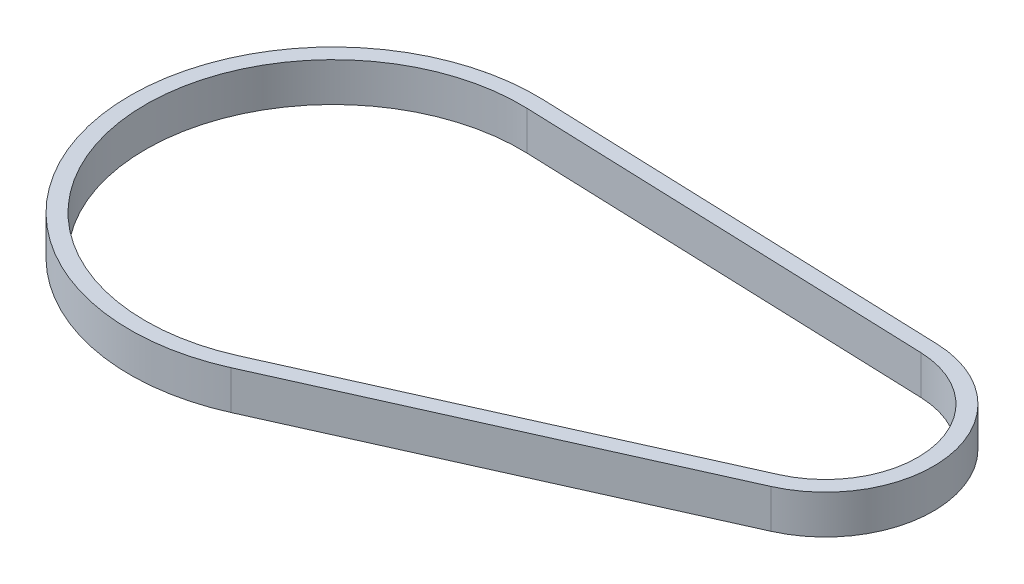
ISO-10303-21;
HEADER;
FILE_DESCRIPTION(('STEP AP214'),'2;1');
FILE_NAME('part.step','',(''),(''),'','','');
FILE_SCHEMA(('AUTOMOTIVE_DESIGN { 1 0 10303 214 1 1 1 1 }'));
ENDSEC;
DATA;
#1=APPLICATION_CONTEXT('core data for automotive mechanical design processes');
#2=APPLICATION_PROTOCOL_DEFINITION('international standard','automotive_design',2000,#1);
#3=PRODUCT_CONTEXT('',#1,'mechanical');
#4=PRODUCT('Part','Part','',(#3));
#5=PRODUCT_RELATED_PRODUCT_CATEGORY('part','',(#4));
#6=PRODUCT_DEFINITION_FORMATION('','',#4);
#7=PRODUCT_DEFINITION_CONTEXT('part definition',#1,'design');
#8=PRODUCT_DEFINITION('design','',#6,#7);
#9=PRODUCT_DEFINITION_SHAPE('','',#8);
#10=(LENGTH_UNIT() NAMED_UNIT(*) SI_UNIT(.MILLI.,.METRE.));
#11=(NAMED_UNIT(*) PLANE_ANGLE_UNIT() SI_UNIT($,.RADIAN.));
#12=(NAMED_UNIT(*) SI_UNIT($,.STERADIAN.) SOLID_ANGLE_UNIT());
#13=UNCERTAINTY_MEASURE_WITH_UNIT(LENGTH_MEASURE(1.E-05),#10,'distance_accuracy_value','');
#14=(GEOMETRIC_REPRESENTATION_CONTEXT(3) GLOBAL_UNCERTAINTY_ASSIGNED_CONTEXT((#13)) GLOBAL_UNIT_ASSIGNED_CONTEXT((#10,
#11,#12)) REPRESENTATION_CONTEXT('',''));
#15=CARTESIAN_POINT('',(0.,0.,0.));
#16=DIRECTION('',(0.,0.,1.));
#17=DIRECTION('',(1.,0.,0.));
#18=AXIS2_PLACEMENT_3D('',#15,#16,#17);
#19=CARTESIAN_POINT('',(0.,10.,0.));
#20=DIRECTION('',(0.,1.,0.));
#21=DIRECTION('',(0.,0.,1.));
#22=AXIS2_PLACEMENT_3D('',#19,#20,#21);
#23=PLANE('',#22);
#24=CARTESIAN_POINT('',(0.,10.,0.));
#25=DIRECTION('',(0.,1.,0.));
#26=DIRECTION('',(0.,0.,1.));
#27=AXIS2_PLACEMENT_3D('',#24,#25,#26);
#28=CIRCLE('',#27,52.26);
#29=CARTESIAN_POINT('',(1.87511613569764,10.,-52.2263490919827));
#30=VERTEX_POINT('',#29);
#31=CARTESIAN_POINT('',(21.3772791952172,10.,47.687729388279));
#32=VERTEX_POINT('',#31);
#33=EDGE_CURVE('E159',#30,#32,#28,.T.);
#34=ORIENTED_EDGE('',*,*,#33,.T.);
#35=DIRECTION('',(0.912509173139668,0.,-0.409056241776067));
#36=VECTOR('',#35,1.);
#37=CARTESIAN_POINT('',(117.363223433667,10.,4.65950482981999));
#38=LINE('',#37,#36);
#39=CARTESIAN_POINT('',(117.363223433667,10.,4.65950482981999));
#40=VERTEX_POINT('',#39);
#41=EDGE_CURVE('E163',#32,#40,#38,.T.);
#42=ORIENTED_EDGE('',*,*,#41,.T.);
#43=CARTESIAN_POINT('',(105.999641037128,10.,-20.69));
#44=DIRECTION('',(0.,1.,0.));
#45=DIRECTION('',(0.,0.,1.));
#46=AXIS2_PLACEMENT_3D('',#43,#44,#45);
#47=CIRCLE('',#46,27.78);
#48=CARTESIAN_POINT('',(106.996401968044,10.,-48.4521120890792));
#49=VERTEX_POINT('',#48);
#50=EDGE_CURVE('E167',#40,#49,#47,.T.);
#51=ORIENTED_EDGE('',*,*,#50,.T.);
#52=DIRECTION('',(-0.999356086719915,0.,-0.0358805230711372));
#53=VECTOR('',#52,1.);
#54=CARTESIAN_POINT('',(1.87511613569764,10.,-52.2263490919827));
#55=LINE('',#54,#53);
#56=EDGE_CURVE('E170',#49,#30,#55,.T.);
#57=ORIENTED_EDGE('',*,*,#56,.T.);
#58=EDGE_LOOP('',(#34,#42,#51,#57));
#59=FACE_BOUND('',#58,.T.);
#60=DIRECTION('',(-0.999356086719915,0.,-0.0358805230711372));
#61=VECTOR('',#60,1.);
#62=CARTESIAN_POINT('',(1.73159404341309,10.,-48.2289247451031));
#63=LINE('',#62,#61);
#64=CARTESIAN_POINT('',(106.85287987576,10.,-44.4546877421996));
#65=VERTEX_POINT('',#64);
#66=CARTESIAN_POINT('',(1.73159404341309,10.,-48.2289247451031));
#67=VERTEX_POINT('',#66);
#68=EDGE_CURVE('E120',#65,#67,#63,.T.);
#69=ORIENTED_EDGE('',*,*,#68,.F.);
#70=CARTESIAN_POINT('',(105.999641037128,10.,-20.69));
#71=DIRECTION('',(0.,1.,0.));
#72=DIRECTION('',(0.,0.,1.));
#73=AXIS2_PLACEMENT_3D('',#70,#71,#72);
#74=CIRCLE('',#73,23.78);
#75=CARTESIAN_POINT('',(115.726998466563,10.,1.00946813726131));
#76=VERTEX_POINT('',#75);
#77=EDGE_CURVE('E111',#76,#65,#74,.T.);
#78=ORIENTED_EDGE('',*,*,#77,.F.);
#79=DIRECTION('',(0.912509173139668,0.,-0.409056241776067));
#80=VECTOR('',#79,1.);
#81=CARTESIAN_POINT('',(115.726998466563,10.,1.00946813726131));
#82=LINE('',#81,#80);
#83=CARTESIAN_POINT('',(19.741054228113,10.,44.0376926957204));
#84=VERTEX_POINT('',#83);
#85=EDGE_CURVE('E137',#84,#76,#82,.T.);
#86=ORIENTED_EDGE('',*,*,#85,.F.);
#87=CARTESIAN_POINT('',(0.,10.,0.));
#88=DIRECTION('',(0.,1.,0.));
#89=DIRECTION('',(0.,0.,1.));
#90=AXIS2_PLACEMENT_3D('',#87,#88,#89);
#91=CIRCLE('',#90,48.26);
#92=EDGE_CURVE('E133',#67,#84,#91,.T.);
#93=ORIENTED_EDGE('',*,*,#92,.F.);
#94=EDGE_LOOP('',(#69,#78,#86,#93));
#95=FACE_BOUND('',#94,.T.);
#96=ADVANCED_FACE('F45',(#59,#95),#23,.T.);
#97=CARTESIAN_POINT('',(0.,0.,0.));
#98=DIRECTION('',(0.,1.,0.));
#99=DIRECTION('',(0.,0.,1.));
#100=AXIS2_PLACEMENT_3D('',#97,#98,#99);
#101=PLANE('',#100);
#102=CARTESIAN_POINT('',(0.,0.,0.));
#103=DIRECTION('',(0.,1.,0.));
#104=DIRECTION('',(0.,0.,1.));
#105=AXIS2_PLACEMENT_3D('',#102,#103,#104);
#106=CIRCLE('',#105,52.26);
#107=CARTESIAN_POINT('',(1.87511613569764,0.,-52.2263490919827));
#108=VERTEX_POINT('',#107);
#109=CARTESIAN_POINT('',(21.3772791952172,0.,47.687729388279));
#110=VERTEX_POINT('',#109);
#111=EDGE_CURVE('E129',#108,#110,#106,.T.);
#112=ORIENTED_EDGE('',*,*,#111,.F.);
#113=DIRECTION('',(-0.999356086719915,0.,-0.0358805230711372));
#114=VECTOR('',#113,1.);
#115=CARTESIAN_POINT('',(1.87511613569764,0.,-52.2263490919827));
#116=LINE('',#115,#114);
#117=CARTESIAN_POINT('',(106.996401968044,0.,-48.4521120890792));
#118=VERTEX_POINT('',#117);
#119=EDGE_CURVE('E164',#118,#108,#116,.T.);
#120=ORIENTED_EDGE('',*,*,#119,.F.);
#121=CARTESIAN_POINT('',(105.999641037128,0.,-20.69));
#122=DIRECTION('',(0.,1.,0.));
#123=DIRECTION('',(0.,0.,1.));
#124=AXIS2_PLACEMENT_3D('',#121,#122,#123);
#125=CIRCLE('',#124,27.78);
#126=CARTESIAN_POINT('',(117.363223433667,0.,4.65950482981999));
#127=VERTEX_POINT('',#126);
#128=EDGE_CURVE('E180',#127,#118,#125,.T.);
#129=ORIENTED_EDGE('',*,*,#128,.F.);
#130=DIRECTION('',(0.912509173139668,0.,-0.409056241776067));
#131=VECTOR('',#130,1.);
#132=CARTESIAN_POINT('',(117.363223433667,0.,4.65950482981999));
#133=LINE('',#132,#131);
#134=EDGE_CURVE('E177',#110,#127,#133,.T.);
#135=ORIENTED_EDGE('',*,*,#134,.F.);
#136=EDGE_LOOP('',(#112,#120,#129,#135));
#137=FACE_BOUND('',#136,.T.);
#138=CARTESIAN_POINT('',(105.999641037128,0.,-20.69));
#139=DIRECTION('',(0.,1.,0.));
#140=DIRECTION('',(0.,0.,1.));
#141=AXIS2_PLACEMENT_3D('',#138,#139,#140);
#142=CIRCLE('',#141,23.78);
#143=CARTESIAN_POINT('',(115.726998466563,0.,1.0094681372613));
#144=VERTEX_POINT('',#143);
#145=CARTESIAN_POINT('',(106.85287987576,0.,-44.4546877421996));
#146=VERTEX_POINT('',#145);
#147=EDGE_CURVE('E69',#144,#146,#142,.T.);
#148=ORIENTED_EDGE('',*,*,#147,.T.);
#149=DIRECTION('',(-0.999356086719915,0.,-0.0358805230711372));
#150=VECTOR('',#149,1.);
#151=CARTESIAN_POINT('',(1.73159404341309,0.,-48.2289247451031));
#152=LINE('',#151,#150);
#153=CARTESIAN_POINT('',(1.73159404341309,0.,-48.2289247451031));
#154=VERTEX_POINT('',#153);
#155=EDGE_CURVE('E127',#146,#154,#152,.T.);
#156=ORIENTED_EDGE('',*,*,#155,.T.);
#157=CARTESIAN_POINT('',(0.,0.,0.));
#158=DIRECTION('',(0.,1.,0.));
#159=DIRECTION('',(0.,0.,1.));
#160=AXIS2_PLACEMENT_3D('',#157,#158,#159);
#161=CIRCLE('',#160,48.26);
#162=CARTESIAN_POINT('',(19.741054228113,0.,44.0376926957204));
#163=VERTEX_POINT('',#162);
#164=EDGE_CURVE('E146',#154,#163,#161,.T.);
#165=ORIENTED_EDGE('',*,*,#164,.T.);
#166=DIRECTION('',(0.912509173139668,0.,-0.409056241776067));
#167=VECTOR('',#166,1.);
#168=CARTESIAN_POINT('',(115.726998466563,0.,1.00946813726131));
#169=LINE('',#168,#167);
#170=EDGE_CURVE('E121',#163,#144,#169,.T.);
#171=ORIENTED_EDGE('',*,*,#170,.T.);
#172=EDGE_LOOP('',(#148,#156,#165,#171));
#173=FACE_BOUND('',#172,.T.);
#174=ADVANCED_FACE('F203',(#137,#173),#101,.F.);
#175=CARTESIAN_POINT('',(0.,10.,0.));
#176=DIRECTION('',(0.,-1.,0.));
#177=DIRECTION('',(0.,0.,-1.));
#178=AXIS2_PLACEMENT_3D('',#175,#176,#177);
#179=CYLINDRICAL_SURFACE('',#178,52.26);
#180=ORIENTED_EDGE('',*,*,#111,.T.);
#181=DIRECTION('',(0.,-1.,0.));
#182=VECTOR('',#181,1.);
#183=CARTESIAN_POINT('',(21.3772791952172,10.,47.687729388279));
#184=LINE('',#183,#182);
#185=EDGE_CURVE('E11',#32,#110,#184,.T.);
#186=ORIENTED_EDGE('',*,*,#185,.F.);
#187=ORIENTED_EDGE('',*,*,#33,.F.);
#188=DIRECTION('',(0.,-1.,0.));
#189=VECTOR('',#188,1.);
#190=CARTESIAN_POINT('',(1.87511613569764,10.,-52.2263490919827));
#191=LINE('',#190,#189);
#192=EDGE_CURVE('E173',#30,#108,#191,.T.);
#193=ORIENTED_EDGE('',*,*,#192,.T.);
#194=EDGE_LOOP('',(#180,#186,#187,#193));
#195=FACE_BOUND('',#194,.T.);
#196=ADVANCED_FACE('F47',(#195),#179,.T.);
#197=CARTESIAN_POINT('',(117.363223433667,10.,4.65950482981999));
#198=DIRECTION('',(-0.409056241776067,0.,-0.912509173139668));
#199=DIRECTION('',(-0.912509173139668,0.,0.409056241776067));
#200=AXIS2_PLACEMENT_3D('',#197,#198,#199);
#201=PLANE('',#200);
#202=ORIENTED_EDGE('',*,*,#134,.T.);
#203=DIRECTION('',(0.,-1.,0.));
#204=VECTOR('',#203,1.);
#205=CARTESIAN_POINT('',(117.363223433667,10.,4.65950482981999));
#206=LINE('',#205,#204);
#207=EDGE_CURVE('E54',#40,#127,#206,.T.);
#208=ORIENTED_EDGE('',*,*,#207,.F.);
#209=ORIENTED_EDGE('',*,*,#41,.F.);
#210=ORIENTED_EDGE('',*,*,#185,.T.);
#211=EDGE_LOOP('',(#202,#208,#209,#210));
#212=FACE_BOUND('',#211,.T.);
#213=ADVANCED_FACE('F213',(#212),#201,.F.);
#214=CARTESIAN_POINT('',(105.999641037128,10.,-20.69));
#215=DIRECTION('',(0.,-1.,0.));
#216=DIRECTION('',(0.,0.,-1.));
#217=AXIS2_PLACEMENT_3D('',#214,#215,#216);
#218=CYLINDRICAL_SURFACE('',#217,27.78);
#219=ORIENTED_EDGE('',*,*,#128,.T.);
#220=DIRECTION('',(0.,-1.,0.));
#221=VECTOR('',#220,1.);
#222=CARTESIAN_POINT('',(106.996401968044,10.,-48.4521120890792));
#223=LINE('',#222,#221);
#224=EDGE_CURVE('E188',#49,#118,#223,.T.);
#225=ORIENTED_EDGE('',*,*,#224,.F.);
#226=ORIENTED_EDGE('',*,*,#50,.F.);
#227=ORIENTED_EDGE('',*,*,#207,.T.);
#228=EDGE_LOOP('',(#219,#225,#226,#227));
#229=FACE_BOUND('',#228,.T.);
#230=ADVANCED_FACE('F197',(#229),#218,.T.);
#231=CARTESIAN_POINT('',(1.87511613569764,10.,-52.2263490919827));
#232=DIRECTION('',(-0.0358805230711372,0.,0.999356086719915));
#233=DIRECTION('',(0.999356086719915,0.,0.0358805230711372));
#234=AXIS2_PLACEMENT_3D('',#231,#232,#233);
#235=PLANE('',#234);
#236=ORIENTED_EDGE('',*,*,#119,.T.);
#237=ORIENTED_EDGE('',*,*,#192,.F.);
#238=ORIENTED_EDGE('',*,*,#56,.F.);
#239=ORIENTED_EDGE('',*,*,#224,.T.);
#240=EDGE_LOOP('',(#236,#237,#238,#239));
#241=FACE_BOUND('',#240,.T.);
#242=ADVANCED_FACE('F207',(#241),#235,.F.);
#243=CARTESIAN_POINT('',(105.999641037128,10.,-20.69));
#244=DIRECTION('',(0.,-1.,0.));
#245=DIRECTION('',(0.,0.,-1.));
#246=AXIS2_PLACEMENT_3D('',#243,#244,#245);
#247=CYLINDRICAL_SURFACE('',#246,23.78);
#248=ORIENTED_EDGE('',*,*,#147,.F.);
#249=DIRECTION('',(0.,-1.,0.));
#250=VECTOR('',#249,1.);
#251=CARTESIAN_POINT('',(115.726998466563,10.,1.00946813726131));
#252=LINE('',#251,#250);
#253=EDGE_CURVE('E115',#76,#144,#252,.T.);
#254=ORIENTED_EDGE('',*,*,#253,.F.);
#255=ORIENTED_EDGE('',*,*,#77,.T.);
#256=DIRECTION('',(0.,-1.,0.));
#257=VECTOR('',#256,1.);
#258=CARTESIAN_POINT('',(106.85287987576,10.,-44.4546877421996));
#259=LINE('',#258,#257);
#260=EDGE_CURVE('E114',#65,#146,#259,.T.);
#261=ORIENTED_EDGE('',*,*,#260,.T.);
#262=EDGE_LOOP('',(#248,#254,#255,#261));
#263=FACE_BOUND('',#262,.T.);
#264=ADVANCED_FACE('F113',(#263),#247,.F.);
#265=CARTESIAN_POINT('',(1.73159404341309,10.,-48.2289247451031));
#266=DIRECTION('',(-0.0358805230711372,0.,0.999356086719915));
#267=DIRECTION('',(0.999356086719915,0.,0.0358805230711372));
#268=AXIS2_PLACEMENT_3D('',#265,#266,#267);
#269=PLANE('',#268);
#270=ORIENTED_EDGE('',*,*,#155,.F.);
#271=ORIENTED_EDGE('',*,*,#260,.F.);
#272=ORIENTED_EDGE('',*,*,#68,.T.);
#273=DIRECTION('',(0.,-1.,0.));
#274=VECTOR('',#273,1.);
#275=CARTESIAN_POINT('',(1.73159404341309,10.,-48.2289247451031));
#276=LINE('',#275,#274);
#277=EDGE_CURVE('E130',#67,#154,#276,.T.);
#278=ORIENTED_EDGE('',*,*,#277,.T.);
#279=EDGE_LOOP('',(#270,#271,#272,#278));
#280=FACE_BOUND('',#279,.T.);
#281=ADVANCED_FACE('F124',(#280),#269,.T.);
#282=CARTESIAN_POINT('',(0.,10.,0.));
#283=DIRECTION('',(0.,-1.,0.));
#284=DIRECTION('',(0.,0.,-1.));
#285=AXIS2_PLACEMENT_3D('',#282,#283,#284);
#286=CYLINDRICAL_SURFACE('',#285,48.26);
#287=ORIENTED_EDGE('',*,*,#164,.F.);
#288=ORIENTED_EDGE('',*,*,#277,.F.);
#289=ORIENTED_EDGE('',*,*,#92,.T.);
#290=DIRECTION('',(0.,-1.,0.));
#291=VECTOR('',#290,1.);
#292=CARTESIAN_POINT('',(19.741054228113,10.,44.0376926957204));
#293=LINE('',#292,#291);
#294=EDGE_CURVE('E61',#84,#163,#293,.T.);
#295=ORIENTED_EDGE('',*,*,#294,.T.);
#296=EDGE_LOOP('',(#287,#288,#289,#295));
#297=FACE_BOUND('',#296,.T.);
#298=ADVANCED_FACE('F236',(#297),#286,.F.);
#299=CARTESIAN_POINT('',(115.726998466563,10.,1.00946813726131));
#300=DIRECTION('',(-0.409056241776067,0.,-0.912509173139668));
#301=DIRECTION('',(-0.912509173139668,0.,0.409056241776067));
#302=AXIS2_PLACEMENT_3D('',#299,#300,#301);
#303=PLANE('',#302);
#304=ORIENTED_EDGE('',*,*,#170,.F.);
#305=ORIENTED_EDGE('',*,*,#294,.F.);
#306=ORIENTED_EDGE('',*,*,#85,.T.);
#307=ORIENTED_EDGE('',*,*,#253,.T.);
#308=EDGE_LOOP('',(#304,#305,#306,#307));
#309=FACE_BOUND('',#308,.T.);
#310=ADVANCED_FACE('F240',(#309),#303,.T.);
#311=CLOSED_SHELL('',(#96,#174,#196,#213,#230,#242,#264,#281,#298,#310));
#312=MANIFOLD_SOLID_BREP('B2',#311);
#313=ADVANCED_BREP_SHAPE_REPRESENTATION('',(#18,#312),#14);
#314=SHAPE_DEFINITION_REPRESENTATION(#9,#313);
ENDSEC;
END-ISO-10303-21;
